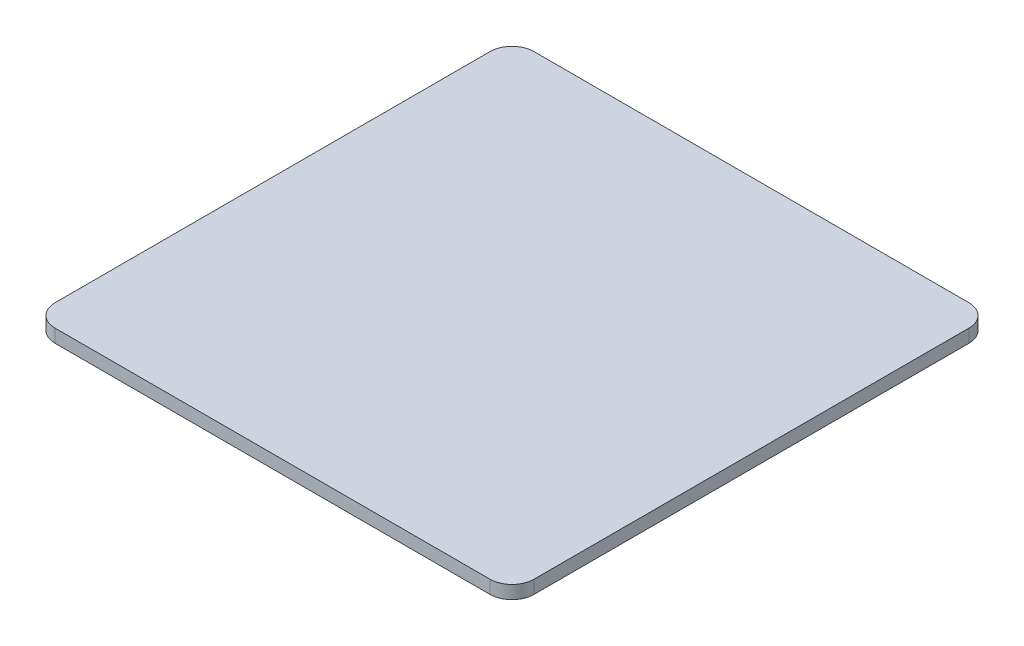
ISO-10303-21;
HEADER;
FILE_DESCRIPTION(('STEP AP214'),'2;1');
FILE_NAME('part.step','',(''),(''),'','','');
FILE_SCHEMA(('AUTOMOTIVE_DESIGN { 1 0 10303 214 1 1 1 1 }'));
ENDSEC;
DATA;
#1=APPLICATION_CONTEXT('core data for automotive mechanical design processes');
#2=APPLICATION_PROTOCOL_DEFINITION('international standard','automotive_design',2000,#1);
#3=PRODUCT_CONTEXT('',#1,'mechanical');
#4=PRODUCT('Part','Part','',(#3));
#5=PRODUCT_RELATED_PRODUCT_CATEGORY('part','',(#4));
#6=PRODUCT_DEFINITION_FORMATION('','',#4);
#7=PRODUCT_DEFINITION_CONTEXT('part definition',#1,'design');
#8=PRODUCT_DEFINITION('design','',#6,#7);
#9=PRODUCT_DEFINITION_SHAPE('','',#8);
#10=(LENGTH_UNIT() NAMED_UNIT(*) SI_UNIT(.MILLI.,.METRE.));
#11=(NAMED_UNIT(*) PLANE_ANGLE_UNIT() SI_UNIT($,.RADIAN.));
#12=(NAMED_UNIT(*) SI_UNIT($,.STERADIAN.) SOLID_ANGLE_UNIT());
#13=UNCERTAINTY_MEASURE_WITH_UNIT(LENGTH_MEASURE(1.E-05),#10,'distance_accuracy_value','');
#14=(GEOMETRIC_REPRESENTATION_CONTEXT(3) GLOBAL_UNCERTAINTY_ASSIGNED_CONTEXT((#13)) GLOBAL_UNIT_ASSIGNED_CONTEXT((#10,
#11,#12)) REPRESENTATION_CONTEXT('',''));
#15=CARTESIAN_POINT('',(0.,0.,0.));
#16=DIRECTION('',(0.,0.,1.));
#17=DIRECTION('',(1.,0.,0.));
#18=AXIS2_PLACEMENT_3D('',#15,#16,#17);
#19=CARTESIAN_POINT('',(208.,6.,-10.));
#20=DIRECTION('',(0.,-1.,0.));
#21=DIRECTION('',(0.,0.,-1.));
#22=AXIS2_PLACEMENT_3D('',#19,#20,#21);
#23=CYLINDRICAL_SURFACE('',#22,10.);
#24=CARTESIAN_POINT('',(208.,0.,-10.));
#25=DIRECTION('',(0.,1.,0.));
#26=DIRECTION('',(0.,0.,1.));
#27=AXIS2_PLACEMENT_3D('',#24,#25,#26);
#28=CIRCLE('',#27,10.);
#29=CARTESIAN_POINT('',(208.,0.,0.));
#30=VERTEX_POINT('',#29);
#31=CARTESIAN_POINT('',(218.,0.,-10.0000000000001));
#32=VERTEX_POINT('',#31);
#33=EDGE_CURVE('E130',#30,#32,#28,.T.);
#34=ORIENTED_EDGE('',*,*,#33,.T.);
#35=DIRECTION('',(0.,-1.,0.));
#36=VECTOR('',#35,1.);
#37=CARTESIAN_POINT('',(218.,6.,-10.0000000000001));
#38=LINE('',#37,#36);
#39=CARTESIAN_POINT('',(218.,6.,-10.0000000000001));
#40=VERTEX_POINT('',#39);
#41=EDGE_CURVE('E11',#40,#32,#38,.T.);
#42=ORIENTED_EDGE('',*,*,#41,.F.);
#43=CARTESIAN_POINT('',(208.,6.,-10.));
#44=DIRECTION('',(0.,1.,0.));
#45=DIRECTION('',(0.,0.,1.));
#46=AXIS2_PLACEMENT_3D('',#43,#44,#45);
#47=CIRCLE('',#46,10.);
#48=CARTESIAN_POINT('',(208.,6.,0.));
#49=VERTEX_POINT('',#48);
#50=EDGE_CURVE('E144',#49,#40,#47,.T.);
#51=ORIENTED_EDGE('',*,*,#50,.F.);
#52=DIRECTION('',(0.,-1.,0.));
#53=VECTOR('',#52,1.);
#54=CARTESIAN_POINT('',(208.,6.,0.));
#55=LINE('',#54,#53);
#56=EDGE_CURVE('E126',#49,#30,#55,.T.);
#57=ORIENTED_EDGE('',*,*,#56,.T.);
#58=EDGE_LOOP('',(#34,#42,#51,#57));
#59=FACE_BOUND('',#58,.T.);
#60=ADVANCED_FACE('F34',(#59),#23,.T.);
#61=CARTESIAN_POINT('',(218.,6.,-10.0000000000001));
#62=DIRECTION('',(-1.,0.,0.));
#63=DIRECTION('',(0.,0.,1.));
#64=AXIS2_PLACEMENT_3D('',#61,#62,#63);
#65=PLANE('',#64);
#66=DIRECTION('',(0.,0.,-1.));
#67=VECTOR('',#66,1.);
#68=CARTESIAN_POINT('',(218.,0.,-10.0000000000001));
#69=LINE('',#68,#67);
#70=CARTESIAN_POINT('',(218.,0.,-208.));
#71=VERTEX_POINT('',#70);
#72=EDGE_CURVE('E133',#32,#71,#69,.T.);
#73=ORIENTED_EDGE('',*,*,#72,.T.);
#74=DIRECTION('',(0.,-1.,0.));
#75=VECTOR('',#74,1.);
#76=CARTESIAN_POINT('',(218.,6.,-208.));
#77=LINE('',#76,#75);
#78=CARTESIAN_POINT('',(218.,6.,-208.));
#79=VERTEX_POINT('',#78);
#80=EDGE_CURVE('E42',#79,#71,#77,.T.);
#81=ORIENTED_EDGE('',*,*,#80,.F.);
#82=DIRECTION('',(0.,0.,-1.));
#83=VECTOR('',#82,1.);
#84=CARTESIAN_POINT('',(218.,6.,-10.0000000000001));
#85=LINE('',#84,#83);
#86=EDGE_CURVE('E93',#40,#79,#85,.T.);
#87=ORIENTED_EDGE('',*,*,#86,.F.);
#88=ORIENTED_EDGE('',*,*,#41,.T.);
#89=EDGE_LOOP('',(#73,#81,#87,#88));
#90=FACE_BOUND('',#89,.T.);
#91=ADVANCED_FACE('F179',(#90),#65,.F.);
#92=CARTESIAN_POINT('',(208.,6.,-208.));
#93=DIRECTION('',(0.,-1.,0.));
#94=DIRECTION('',(0.,0.,-1.));
#95=AXIS2_PLACEMENT_3D('',#92,#93,#94);
#96=CYLINDRICAL_SURFACE('',#95,10.);
#97=CARTESIAN_POINT('',(208.,0.,-208.));
#98=DIRECTION('',(0.,1.,0.));
#99=DIRECTION('',(0.,0.,-1.));
#100=AXIS2_PLACEMENT_3D('',#97,#98,#99);
#101=CIRCLE('',#100,10.);
#102=CARTESIAN_POINT('',(208.,0.,-218.));
#103=VERTEX_POINT('',#102);
#104=EDGE_CURVE('E135',#71,#103,#101,.T.);
#105=ORIENTED_EDGE('',*,*,#104,.T.);
#106=DIRECTION('',(0.,-1.,0.));
#107=VECTOR('',#106,1.);
#108=CARTESIAN_POINT('',(208.,6.,-218.));
#109=LINE('',#108,#107);
#110=CARTESIAN_POINT('',(208.,6.,-218.));
#111=VERTEX_POINT('',#110);
#112=EDGE_CURVE('E151',#111,#103,#109,.T.);
#113=ORIENTED_EDGE('',*,*,#112,.F.);
#114=CARTESIAN_POINT('',(208.,6.,-208.));
#115=DIRECTION('',(0.,1.,0.));
#116=DIRECTION('',(0.,0.,-1.));
#117=AXIS2_PLACEMENT_3D('',#114,#115,#116);
#118=CIRCLE('',#117,10.);
#119=EDGE_CURVE('E159',#79,#111,#118,.T.);
#120=ORIENTED_EDGE('',*,*,#119,.F.);
#121=ORIENTED_EDGE('',*,*,#80,.T.);
#122=EDGE_LOOP('',(#105,#113,#120,#121));
#123=FACE_BOUND('',#122,.T.);
#124=ADVANCED_FACE('F157',(#123),#96,.T.);
#125=CARTESIAN_POINT('',(10.0000000000001,6.,-218.));
#126=DIRECTION('',(0.,0.,1.));
#127=DIRECTION('',(1.,0.,0.));
#128=AXIS2_PLACEMENT_3D('',#125,#126,#127);
#129=PLANE('',#128);
#130=DIRECTION('',(-1.,0.,0.));
#131=VECTOR('',#130,1.);
#132=CARTESIAN_POINT('',(10.0000000000001,0.,-218.));
#133=LINE('',#132,#131);
#134=CARTESIAN_POINT('',(10.,0.,-218.));
#135=VERTEX_POINT('',#134);
#136=EDGE_CURVE('E137',#103,#135,#133,.T.);
#137=ORIENTED_EDGE('',*,*,#136,.T.);
#138=DIRECTION('',(0.,-1.,0.));
#139=VECTOR('',#138,1.);
#140=CARTESIAN_POINT('',(10.,6.,-218.));
#141=LINE('',#140,#139);
#142=CARTESIAN_POINT('',(10.,6.,-218.));
#143=VERTEX_POINT('',#142);
#144=EDGE_CURVE('E148',#143,#135,#141,.T.);
#145=ORIENTED_EDGE('',*,*,#144,.F.);
#146=DIRECTION('',(-1.,0.,0.));
#147=VECTOR('',#146,1.);
#148=CARTESIAN_POINT('',(10.0000000000001,6.,-218.));
#149=LINE('',#148,#147);
#150=EDGE_CURVE('E171',#111,#143,#149,.T.);
#151=ORIENTED_EDGE('',*,*,#150,.F.);
#152=ORIENTED_EDGE('',*,*,#112,.T.);
#153=EDGE_LOOP('',(#137,#145,#151,#152));
#154=FACE_BOUND('',#153,.T.);
#155=ADVANCED_FACE('F167',(#154),#129,.F.);
#156=CARTESIAN_POINT('',(10.,6.,-208.));
#157=DIRECTION('',(0.,-1.,0.));
#158=DIRECTION('',(0.,0.,-1.));
#159=AXIS2_PLACEMENT_3D('',#156,#157,#158);
#160=CYLINDRICAL_SURFACE('',#159,10.);
#161=CARTESIAN_POINT('',(10.,0.,-208.));
#162=DIRECTION('',(0.,1.,0.));
#163=DIRECTION('',(0.,0.,-1.));
#164=AXIS2_PLACEMENT_3D('',#161,#162,#163);
#165=CIRCLE('',#164,10.);
#166=CARTESIAN_POINT('',(0.,0.,-208.));
#167=VERTEX_POINT('',#166);
#168=EDGE_CURVE('E139',#135,#167,#165,.T.);
#169=ORIENTED_EDGE('',*,*,#168,.T.);
#170=DIRECTION('',(0.,-1.,0.));
#171=VECTOR('',#170,1.);
#172=CARTESIAN_POINT('',(0.,6.,-208.));
#173=LINE('',#172,#171);
#174=CARTESIAN_POINT('',(0.,6.,-208.));
#175=VERTEX_POINT('',#174);
#176=EDGE_CURVE('E121',#175,#167,#173,.T.);
#177=ORIENTED_EDGE('',*,*,#176,.F.);
#178=CARTESIAN_POINT('',(10.,6.,-208.));
#179=DIRECTION('',(0.,1.,0.));
#180=DIRECTION('',(0.,0.,-1.));
#181=AXIS2_PLACEMENT_3D('',#178,#179,#180);
#182=CIRCLE('',#181,10.);
#183=EDGE_CURVE('E112',#143,#175,#182,.T.);
#184=ORIENTED_EDGE('',*,*,#183,.F.);
#185=ORIENTED_EDGE('',*,*,#144,.T.);
#186=EDGE_LOOP('',(#169,#177,#184,#185));
#187=FACE_BOUND('',#186,.T.);
#188=ADVANCED_FACE('F170',(#187),#160,.T.);
#189=CARTESIAN_POINT('',(0.,6.,-10.0000000000001));
#190=DIRECTION('',(1.,0.,0.));
#191=DIRECTION('',(0.,0.,-1.));
#192=AXIS2_PLACEMENT_3D('',#189,#190,#191);
#193=PLANE('',#192);
#194=DIRECTION('',(0.,0.,1.));
#195=VECTOR('',#194,1.);
#196=CARTESIAN_POINT('',(0.,0.,-10.0000000000001));
#197=LINE('',#196,#195);
#198=CARTESIAN_POINT('',(0.,0.,-10.0000000000001));
#199=VERTEX_POINT('',#198);
#200=EDGE_CURVE('E120',#167,#199,#197,.T.);
#201=ORIENTED_EDGE('',*,*,#200,.T.);
#202=DIRECTION('',(0.,-1.,0.));
#203=VECTOR('',#202,1.);
#204=CARTESIAN_POINT('',(0.,6.,-10.0000000000001));
#205=LINE('',#204,#203);
#206=CARTESIAN_POINT('',(0.,6.,-10.0000000000001));
#207=VERTEX_POINT('',#206);
#208=EDGE_CURVE('E117',#207,#199,#205,.T.);
#209=ORIENTED_EDGE('',*,*,#208,.F.);
#210=DIRECTION('',(0.,0.,1.));
#211=VECTOR('',#210,1.);
#212=CARTESIAN_POINT('',(0.,6.,-10.0000000000001));
#213=LINE('',#212,#211);
#214=EDGE_CURVE('E106',#175,#207,#213,.T.);
#215=ORIENTED_EDGE('',*,*,#214,.F.);
#216=ORIENTED_EDGE('',*,*,#176,.T.);
#217=EDGE_LOOP('',(#201,#209,#215,#216));
#218=FACE_BOUND('',#217,.T.);
#219=ADVANCED_FACE('F118',(#218),#193,.F.);
#220=CARTESIAN_POINT('',(10.,6.,-10.));
#221=DIRECTION('',(0.,-1.,0.));
#222=DIRECTION('',(0.,0.,-1.));
#223=AXIS2_PLACEMENT_3D('',#220,#221,#222);
#224=CYLINDRICAL_SURFACE('',#223,10.);
#225=CARTESIAN_POINT('',(10.,0.,-10.));
#226=DIRECTION('',(0.,1.,0.));
#227=DIRECTION('',(0.,0.,-1.));
#228=AXIS2_PLACEMENT_3D('',#225,#226,#227);
#229=CIRCLE('',#228,10.);
#230=CARTESIAN_POINT('',(10.0000000000001,0.,0.));
#231=VERTEX_POINT('',#230);
#232=EDGE_CURVE('E79',#199,#231,#229,.T.);
#233=ORIENTED_EDGE('',*,*,#232,.T.);
#234=DIRECTION('',(0.,-1.,0.));
#235=VECTOR('',#234,1.);
#236=CARTESIAN_POINT('',(10.0000000000001,6.,0.));
#237=LINE('',#236,#235);
#238=CARTESIAN_POINT('',(10.0000000000001,6.,0.));
#239=VERTEX_POINT('',#238);
#240=EDGE_CURVE('E122',#239,#231,#237,.T.);
#241=ORIENTED_EDGE('',*,*,#240,.F.);
#242=CARTESIAN_POINT('',(10.,6.,-10.));
#243=DIRECTION('',(0.,1.,0.));
#244=DIRECTION('',(0.,0.,-1.));
#245=AXIS2_PLACEMENT_3D('',#242,#243,#244);
#246=CIRCLE('',#245,10.);
#247=EDGE_CURVE('E110',#207,#239,#246,.T.);
#248=ORIENTED_EDGE('',*,*,#247,.F.);
#249=ORIENTED_EDGE('',*,*,#208,.T.);
#250=EDGE_LOOP('',(#233,#241,#248,#249));
#251=FACE_BOUND('',#250,.T.);
#252=ADVANCED_FACE('F124',(#251),#224,.T.);
#253=CARTESIAN_POINT('',(10.0000000000001,6.,0.));
#254=DIRECTION('',(0.,0.,-1.));
#255=DIRECTION('',(-1.,0.,0.));
#256=AXIS2_PLACEMENT_3D('',#253,#254,#255);
#257=PLANE('',#256);
#258=DIRECTION('',(1.,0.,0.));
#259=VECTOR('',#258,1.);
#260=CARTESIAN_POINT('',(10.0000000000001,0.,0.));
#261=LINE('',#260,#259);
#262=EDGE_CURVE('E85',#231,#30,#261,.T.);
#263=ORIENTED_EDGE('',*,*,#262,.T.);
#264=ORIENTED_EDGE('',*,*,#56,.F.);
#265=DIRECTION('',(1.,0.,0.));
#266=VECTOR('',#265,1.);
#267=CARTESIAN_POINT('',(10.0000000000001,6.,0.));
#268=LINE('',#267,#266);
#269=EDGE_CURVE('E50',#239,#49,#268,.T.);
#270=ORIENTED_EDGE('',*,*,#269,.F.);
#271=ORIENTED_EDGE('',*,*,#240,.T.);
#272=EDGE_LOOP('',(#263,#264,#270,#271));
#273=FACE_BOUND('',#272,.T.);
#274=ADVANCED_FACE('F195',(#273),#257,.F.);
#275=CARTESIAN_POINT('',(208.,6.,-10.));
#276=DIRECTION('',(0.,1.,0.));
#277=DIRECTION('',(0.,0.,1.));
#278=AXIS2_PLACEMENT_3D('',#275,#276,#277);
#279=PLANE('',#278);
#280=ORIENTED_EDGE('',*,*,#50,.T.);
#281=ORIENTED_EDGE('',*,*,#86,.T.);
#282=ORIENTED_EDGE('',*,*,#119,.T.);
#283=ORIENTED_EDGE('',*,*,#150,.T.);
#284=ORIENTED_EDGE('',*,*,#183,.T.);
#285=ORIENTED_EDGE('',*,*,#214,.T.);
#286=ORIENTED_EDGE('',*,*,#247,.T.);
#287=ORIENTED_EDGE('',*,*,#269,.T.);
#288=EDGE_LOOP('',(#280,#281,#282,#283,#284,#285,#286,#287));
#289=FACE_BOUND('',#288,.T.);
#290=ADVANCED_FACE('F108',(#289),#279,.T.);
#291=CARTESIAN_POINT('',(208.,0.,-10.));
#292=DIRECTION('',(0.,1.,0.));
#293=DIRECTION('',(0.,0.,1.));
#294=AXIS2_PLACEMENT_3D('',#291,#292,#293);
#295=PLANE('',#294);
#296=ORIENTED_EDGE('',*,*,#33,.F.);
#297=ORIENTED_EDGE('',*,*,#262,.F.);
#298=ORIENTED_EDGE('',*,*,#232,.F.);
#299=ORIENTED_EDGE('',*,*,#200,.F.);
#300=ORIENTED_EDGE('',*,*,#168,.F.);
#301=ORIENTED_EDGE('',*,*,#136,.F.);
#302=ORIENTED_EDGE('',*,*,#104,.F.);
#303=ORIENTED_EDGE('',*,*,#72,.F.);
#304=EDGE_LOOP('',(#296,#297,#298,#299,#300,#301,#302,#303));
#305=FACE_BOUND('',#304,.T.);
#306=ADVANCED_FACE('F163',(#305),#295,.F.);
#307=CLOSED_SHELL('',(#60,#91,#124,#155,#188,#219,#252,#274,#290,#306));
#308=MANIFOLD_SOLID_BREP('B2',#307);
#309=ADVANCED_BREP_SHAPE_REPRESENTATION('',(#18,#308),#14);
#310=SHAPE_DEFINITION_REPRESENTATION(#9,#309);
ENDSEC;
END-ISO-10303-21;
